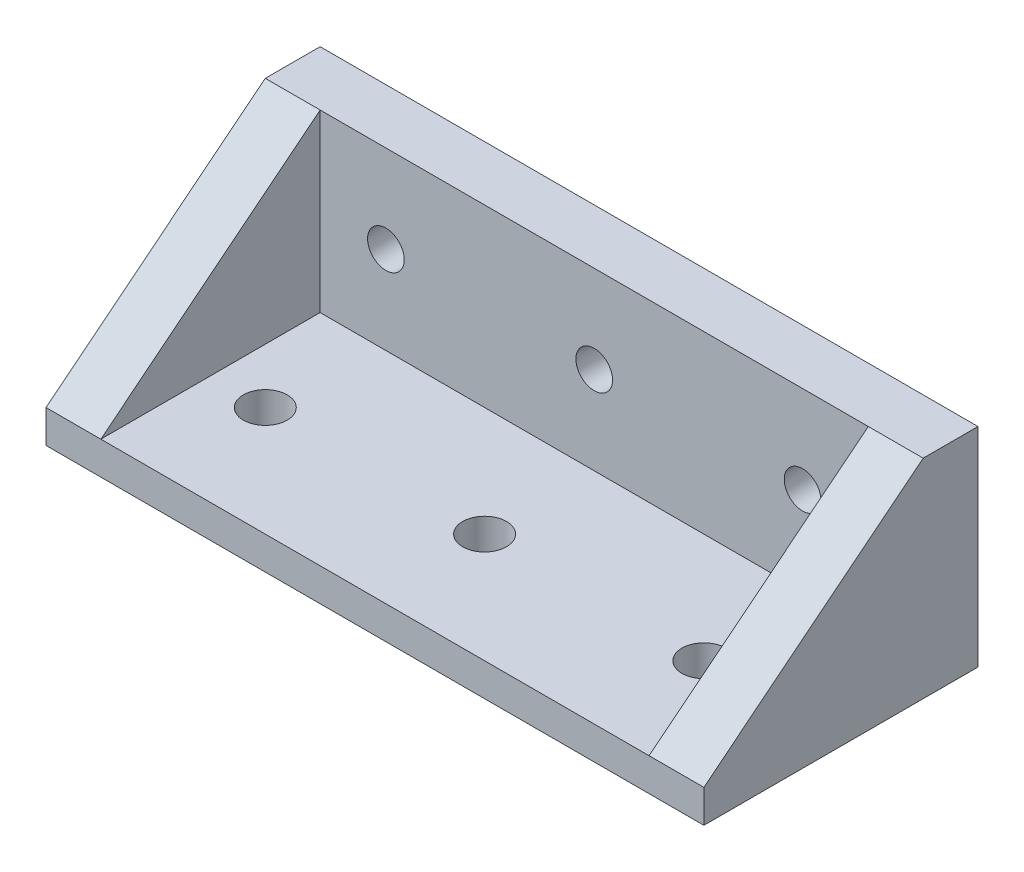
ISO-10303-21;
HEADER;
FILE_DESCRIPTION(('STEP AP214'),'2;1');
FILE_NAME('part.step','',(''),(''),'','','');
FILE_SCHEMA(('AUTOMOTIVE_DESIGN { 1 0 10303 214 1 1 1 1 }'));
ENDSEC;
DATA;
#1=APPLICATION_CONTEXT('core data for automotive mechanical design processes');
#2=APPLICATION_PROTOCOL_DEFINITION('international standard','automotive_design',2000,#1);
#3=PRODUCT_CONTEXT('',#1,'mechanical');
#4=PRODUCT('Part','Part','',(#3));
#5=PRODUCT_RELATED_PRODUCT_CATEGORY('part','',(#4));
#6=PRODUCT_DEFINITION_FORMATION('','',#4);
#7=PRODUCT_DEFINITION_CONTEXT('part definition',#1,'design');
#8=PRODUCT_DEFINITION('design','',#6,#7);
#9=PRODUCT_DEFINITION_SHAPE('','',#8);
#10=(LENGTH_UNIT() NAMED_UNIT(*) SI_UNIT(.MILLI.,.METRE.));
#11=(NAMED_UNIT(*) PLANE_ANGLE_UNIT() SI_UNIT($,.RADIAN.));
#12=(NAMED_UNIT(*) SI_UNIT($,.STERADIAN.) SOLID_ANGLE_UNIT());
#13=UNCERTAINTY_MEASURE_WITH_UNIT(LENGTH_MEASURE(1.E-05),#10,'distance_accuracy_value','');
#14=(GEOMETRIC_REPRESENTATION_CONTEXT(3) GLOBAL_UNCERTAINTY_ASSIGNED_CONTEXT((#13)) GLOBAL_UNIT_ASSIGNED_CONTEXT((#10,
#11,#12)) REPRESENTATION_CONTEXT('',''));
#15=CARTESIAN_POINT('',(0.,0.,0.));
#16=DIRECTION('',(0.,0.,1.));
#17=DIRECTION('',(1.,0.,0.));
#18=AXIS2_PLACEMENT_3D('',#15,#16,#17);
#19=CARTESIAN_POINT('',(0.,0.,5.));
#20=DIRECTION('',(1.,0.,0.));
#21=DIRECTION('',(0.,1.,0.));
#22=AXIS2_PLACEMENT_3D('',#19,#20,#21);
#23=PLANE('',#22);
#24=DIRECTION('',(0.,-1.,0.));
#25=VECTOR('',#24,1.);
#26=CARTESIAN_POINT('',(0.,0.,0.));
#27=LINE('',#26,#25);
#28=CARTESIAN_POINT('',(0.,0.,0.));
#29=VERTEX_POINT('',#28);
#30=CARTESIAN_POINT('',(0.,-19.,0.));
#31=VERTEX_POINT('',#30);
#32=EDGE_CURVE('E140',#29,#31,#27,.T.);
#33=ORIENTED_EDGE('',*,*,#32,.T.);
#34=DIRECTION('',(0.,0.,-1.));
#35=VECTOR('',#34,1.);
#36=CARTESIAN_POINT('',(0.,-19.,5.));
#37=LINE('',#36,#35);
#38=CARTESIAN_POINT('',(0.,-19.,25.));
#39=VERTEX_POINT('',#38);
#40=EDGE_CURVE('E11',#39,#31,#37,.T.);
#41=ORIENTED_EDGE('',*,*,#40,.F.);
#42=DIRECTION('',(0.,-1.,0.));
#43=VECTOR('',#42,1.);
#44=CARTESIAN_POINT('',(0.,-19.,25.));
#45=LINE('',#44,#43);
#46=CARTESIAN_POINT('',(0.,-16.,25.));
#47=VERTEX_POINT('',#46);
#48=EDGE_CURVE('E126',#47,#39,#45,.T.);
#49=ORIENTED_EDGE('',*,*,#48,.F.);
#50=DIRECTION('',(0.,-0.624695047554424,0.78086880944303));
#51=VECTOR('',#50,1.);
#52=CARTESIAN_POINT('',(0.,0.,5.));
#53=LINE('',#52,#51);
#54=CARTESIAN_POINT('',(0.,0.,5.));
#55=VERTEX_POINT('',#54);
#56=EDGE_CURVE('E123',#55,#47,#53,.T.);
#57=ORIENTED_EDGE('',*,*,#56,.F.);
#58=DIRECTION('',(0.,0.,-1.));
#59=VECTOR('',#58,1.);
#60=CARTESIAN_POINT('',(0.,0.,5.));
#61=LINE('',#60,#59);
#62=EDGE_CURVE('E139',#55,#29,#61,.T.);
#63=ORIENTED_EDGE('',*,*,#62,.T.);
#64=EDGE_LOOP('',(#33,#41,#49,#57,#63));
#65=FACE_BOUND('',#64,.T.);
#66=ADVANCED_FACE('F36',(#65),#23,.F.);
#67=CARTESIAN_POINT('',(0.,-19.,5.));
#68=DIRECTION('',(0.,1.,0.));
#69=DIRECTION('',(0.,0.,1.));
#70=AXIS2_PLACEMENT_3D('',#67,#68,#69);
#71=PLANE('',#70);
#72=CARTESIAN_POINT('',(10.,-19.,15.));
#73=DIRECTION('',(0.,1.,0.));
#74=DIRECTION('',(0.,0.,1.));
#75=AXIS2_PLACEMENT_3D('',#72,#73,#74);
#76=CIRCLE('',#75,2.);
#77=CARTESIAN_POINT('',(10.,-19.,17.));
#78=VERTEX_POINT('',#77);
#79=EDGE_CURVE('E356',#78,#78,#76,.T.);
#80=ORIENTED_EDGE('',*,*,#79,.T.);
#81=EDGE_LOOP('',(#80));
#82=FACE_BOUND('',#81,.T.);
#83=CARTESIAN_POINT('',(30.,-19.,15.));
#84=DIRECTION('',(0.,1.,0.));
#85=DIRECTION('',(0.,0.,1.));
#86=AXIS2_PLACEMENT_3D('',#83,#84,#85);
#87=CIRCLE('',#86,2.);
#88=CARTESIAN_POINT('',(30.,-19.,17.));
#89=VERTEX_POINT('',#88);
#90=EDGE_CURVE('E358',#89,#89,#87,.T.);
#91=ORIENTED_EDGE('',*,*,#90,.T.);
#92=EDGE_LOOP('',(#91));
#93=FACE_BOUND('',#92,.T.);
#94=CARTESIAN_POINT('',(50.,-19.,15.));
#95=DIRECTION('',(0.,1.,0.));
#96=DIRECTION('',(0.,0.,1.));
#97=AXIS2_PLACEMENT_3D('',#94,#95,#96);
#98=CIRCLE('',#97,2.);
#99=CARTESIAN_POINT('',(50.,-19.,17.));
#100=VERTEX_POINT('',#99);
#101=EDGE_CURVE('E364',#100,#100,#98,.T.);
#102=ORIENTED_EDGE('',*,*,#101,.T.);
#103=EDGE_LOOP('',(#102));
#104=FACE_BOUND('',#103,.T.);
#105=DIRECTION('',(1.,0.,0.));
#106=VECTOR('',#105,1.);
#107=CARTESIAN_POINT('',(0.,-19.,0.));
#108=LINE('',#107,#106);
#109=CARTESIAN_POINT('',(60.,-19.,0.));
#110=VERTEX_POINT('',#109);
#111=EDGE_CURVE('E143',#31,#110,#108,.T.);
#112=ORIENTED_EDGE('',*,*,#111,.T.);
#113=DIRECTION('',(0.,0.,-1.));
#114=VECTOR('',#113,1.);
#115=CARTESIAN_POINT('',(60.,-19.,5.));
#116=LINE('',#115,#114);
#117=CARTESIAN_POINT('',(60.,-19.,25.));
#118=VERTEX_POINT('',#117);
#119=EDGE_CURVE('E43',#118,#110,#116,.T.);
#120=ORIENTED_EDGE('',*,*,#119,.F.);
#121=DIRECTION('',(1.,0.,0.));
#122=VECTOR('',#121,1.);
#123=CARTESIAN_POINT('',(0.,-19.,25.));
#124=LINE('',#123,#122);
#125=EDGE_CURVE('E129',#39,#118,#124,.T.);
#126=ORIENTED_EDGE('',*,*,#125,.F.);
#127=ORIENTED_EDGE('',*,*,#40,.T.);
#128=EDGE_LOOP('',(#112,#120,#126,#127));
#129=FACE_BOUND('',#128,.T.);
#130=ADVANCED_FACE('F201',(#82,#93,#104,#129),#71,.F.);
#131=CARTESIAN_POINT('',(60.,0.,5.));
#132=DIRECTION('',(-1.,0.,0.));
#133=DIRECTION('',(0.,-1.,0.));
#134=AXIS2_PLACEMENT_3D('',#131,#132,#133);
#135=PLANE('',#134);
#136=DIRECTION('',(0.,0.,-1.));
#137=VECTOR('',#136,1.);
#138=CARTESIAN_POINT('',(60.,0.,5.));
#139=LINE('',#138,#137);
#140=CARTESIAN_POINT('',(60.,0.,5.));
#141=VERTEX_POINT('',#140);
#142=CARTESIAN_POINT('',(60.,0.,0.));
#143=VERTEX_POINT('',#142);
#144=EDGE_CURVE('E149',#141,#143,#139,.T.);
#145=ORIENTED_EDGE('',*,*,#144,.F.);
#146=DIRECTION('',(0.,-0.624695047554424,0.78086880944303));
#147=VECTOR('',#146,1.);
#148=CARTESIAN_POINT('',(60.,0.,5.));
#149=LINE('',#148,#147);
#150=CARTESIAN_POINT('',(60.,-16.,25.));
#151=VERTEX_POINT('',#150);
#152=EDGE_CURVE('E172',#141,#151,#149,.T.);
#153=ORIENTED_EDGE('',*,*,#152,.T.);
#154=DIRECTION('',(0.,1.,0.));
#155=VECTOR('',#154,1.);
#156=CARTESIAN_POINT('',(60.,-19.,25.));
#157=LINE('',#156,#155);
#158=EDGE_CURVE('E158',#118,#151,#157,.T.);
#159=ORIENTED_EDGE('',*,*,#158,.F.);
#160=ORIENTED_EDGE('',*,*,#119,.T.);
#161=DIRECTION('',(0.,1.,0.));
#162=VECTOR('',#161,1.);
#163=CARTESIAN_POINT('',(60.,0.,0.));
#164=LINE('',#163,#162);
#165=EDGE_CURVE('E145',#110,#143,#164,.T.);
#166=ORIENTED_EDGE('',*,*,#165,.T.);
#167=EDGE_LOOP('',(#145,#153,#159,#160,#166));
#168=FACE_BOUND('',#167,.T.);
#169=ADVANCED_FACE('F155',(#168),#135,.F.);
#170=CARTESIAN_POINT('',(0.,0.,5.));
#171=DIRECTION('',(0.,-1.,0.));
#172=DIRECTION('',(0.,0.,-1.));
#173=AXIS2_PLACEMENT_3D('',#170,#171,#172);
#174=PLANE('',#173);
#175=DIRECTION('',(-1.,0.,0.));
#176=VECTOR('',#175,1.);
#177=CARTESIAN_POINT('',(0.,0.,0.));
#178=LINE('',#177,#176);
#179=EDGE_CURVE('E58',#143,#29,#178,.T.);
#180=ORIENTED_EDGE('',*,*,#179,.T.);
#181=ORIENTED_EDGE('',*,*,#62,.F.);
#182=DIRECTION('',(-1.,0.,0.));
#183=VECTOR('',#182,1.);
#184=CARTESIAN_POINT('',(5.,0.,5.));
#185=LINE('',#184,#183);
#186=CARTESIAN_POINT('',(5.,0.,5.));
#187=VERTEX_POINT('',#186);
#188=EDGE_CURVE('E169',#187,#55,#185,.T.);
#189=ORIENTED_EDGE('',*,*,#188,.F.);
#190=DIRECTION('',(-1.,0.,0.));
#191=VECTOR('',#190,1.);
#192=CARTESIAN_POINT('',(0.,0.,5.));
#193=LINE('',#192,#191);
#194=CARTESIAN_POINT('',(55.,0.,5.));
#195=VERTEX_POINT('',#194);
#196=EDGE_CURVE('E122',#195,#187,#193,.T.);
#197=ORIENTED_EDGE('',*,*,#196,.F.);
#198=EDGE_CURVE('E137',#141,#195,#193,.T.);
#199=ORIENTED_EDGE('',*,*,#198,.F.);
#200=ORIENTED_EDGE('',*,*,#144,.T.);
#201=EDGE_LOOP('',(#180,#181,#189,#197,#199,#200));
#202=FACE_BOUND('',#201,.T.);
#203=ADVANCED_FACE('F168',(#202),#174,.F.);
#204=CARTESIAN_POINT('',(0.,0.,5.));
#205=DIRECTION('',(0.,0.,1.));
#206=DIRECTION('',(1.,0.,0.));
#207=AXIS2_PLACEMENT_3D('',#204,#205,#206);
#208=PLANE('',#207);
#209=CARTESIAN_POINT('',(11.,-8.,5.));
#210=DIRECTION('',(0.,0.,1.));
#211=DIRECTION('',(1.,0.,0.));
#212=AXIS2_PLACEMENT_3D('',#209,#210,#211);
#213=CIRCLE('',#212,1.67292172028109);
#214=CARTESIAN_POINT('',(12.6729217202811,-8.,5.));
#215=VERTEX_POINT('',#214);
#216=EDGE_CURVE('E371',#215,#215,#213,.T.);
#217=ORIENTED_EDGE('',*,*,#216,.F.);
#218=EDGE_LOOP('',(#217));
#219=FACE_BOUND('',#218,.T.);
#220=CARTESIAN_POINT('',(30.,-8.,5.));
#221=DIRECTION('',(0.,0.,1.));
#222=DIRECTION('',(1.,0.,0.));
#223=AXIS2_PLACEMENT_3D('',#220,#221,#222);
#224=CIRCLE('',#223,1.6729217202811);
#225=CARTESIAN_POINT('',(31.6729217202811,-8.,5.));
#226=VERTEX_POINT('',#225);
#227=EDGE_CURVE('E377',#226,#226,#224,.T.);
#228=ORIENTED_EDGE('',*,*,#227,.F.);
#229=EDGE_LOOP('',(#228));
#230=FACE_BOUND('',#229,.T.);
#231=CARTESIAN_POINT('',(49.,-8.,5.));
#232=DIRECTION('',(0.,0.,1.));
#233=DIRECTION('',(1.,0.,0.));
#234=AXIS2_PLACEMENT_3D('',#231,#232,#233);
#235=CIRCLE('',#234,1.67292172028109);
#236=CARTESIAN_POINT('',(50.6729217202811,-8.,5.));
#237=VERTEX_POINT('',#236);
#238=EDGE_CURVE('E357',#237,#237,#235,.T.);
#239=ORIENTED_EDGE('',*,*,#238,.F.);
#240=EDGE_LOOP('',(#239));
#241=FACE_BOUND('',#240,.T.);
#242=DIRECTION('',(0.,1.,0.));
#243=VECTOR('',#242,1.);
#244=CARTESIAN_POINT('',(5.,-16.,5.));
#245=LINE('',#244,#243);
#246=CARTESIAN_POINT('',(5.,-16.,5.));
#247=VERTEX_POINT('',#246);
#248=EDGE_CURVE('E106',#247,#187,#245,.T.);
#249=ORIENTED_EDGE('',*,*,#248,.F.);
#250=DIRECTION('',(-1.,0.,0.));
#251=VECTOR('',#250,1.);
#252=CARTESIAN_POINT('',(0.,-16.,5.));
#253=LINE('',#252,#251);
#254=CARTESIAN_POINT('',(55.,-16.,5.));
#255=VERTEX_POINT('',#254);
#256=EDGE_CURVE('E120',#255,#247,#253,.T.);
#257=ORIENTED_EDGE('',*,*,#256,.F.);
#258=DIRECTION('',(0.,1.,0.));
#259=VECTOR('',#258,1.);
#260=CARTESIAN_POINT('',(55.,-16.,5.));
#261=LINE('',#260,#259);
#262=EDGE_CURVE('E175',#255,#195,#261,.T.);
#263=ORIENTED_EDGE('',*,*,#262,.T.);
#264=ORIENTED_EDGE('',*,*,#196,.T.);
#265=EDGE_LOOP('',(#249,#257,#263,#264));
#266=FACE_BOUND('',#265,.T.);
#267=ADVANCED_FACE('F118',(#219,#230,#241,#266),#208,.T.);
#268=CARTESIAN_POINT('',(0.,0.,0.));
#269=DIRECTION('',(0.,0.,1.));
#270=DIRECTION('',(1.,0.,0.));
#271=AXIS2_PLACEMENT_3D('',#268,#269,#270);
#272=PLANE('',#271);
#273=CARTESIAN_POINT('',(11.,-8.,0.));
#274=DIRECTION('',(0.,0.,1.));
#275=DIRECTION('',(1.,0.,0.));
#276=AXIS2_PLACEMENT_3D('',#273,#274,#275);
#277=CIRCLE('',#276,1.67292172028109);
#278=CARTESIAN_POINT('',(12.6729217202811,-8.,0.));
#279=VERTEX_POINT('',#278);
#280=EDGE_CURVE('E368',#279,#279,#277,.T.);
#281=ORIENTED_EDGE('',*,*,#280,.T.);
#282=EDGE_LOOP('',(#281));
#283=FACE_BOUND('',#282,.T.);
#284=CARTESIAN_POINT('',(30.,-8.,0.));
#285=DIRECTION('',(0.,0.,1.));
#286=DIRECTION('',(1.,0.,0.));
#287=AXIS2_PLACEMENT_3D('',#284,#285,#286);
#288=CIRCLE('',#287,1.6729217202811);
#289=CARTESIAN_POINT('',(31.6729217202811,-8.,0.));
#290=VERTEX_POINT('',#289);
#291=EDGE_CURVE('E374',#290,#290,#288,.T.);
#292=ORIENTED_EDGE('',*,*,#291,.T.);
#293=EDGE_LOOP('',(#292));
#294=FACE_BOUND('',#293,.T.);
#295=CARTESIAN_POINT('',(49.,-8.,0.));
#296=DIRECTION('',(0.,0.,1.));
#297=DIRECTION('',(1.,0.,0.));
#298=AXIS2_PLACEMENT_3D('',#295,#296,#297);
#299=CIRCLE('',#298,1.67292172028109);
#300=CARTESIAN_POINT('',(50.6729217202811,-8.,0.));
#301=VERTEX_POINT('',#300);
#302=EDGE_CURVE('E361',#301,#301,#299,.T.);
#303=ORIENTED_EDGE('',*,*,#302,.T.);
#304=EDGE_LOOP('',(#303));
#305=FACE_BOUND('',#304,.T.);
#306=ORIENTED_EDGE('',*,*,#32,.F.);
#307=ORIENTED_EDGE('',*,*,#179,.F.);
#308=ORIENTED_EDGE('',*,*,#165,.F.);
#309=ORIENTED_EDGE('',*,*,#111,.F.);
#310=EDGE_LOOP('',(#306,#307,#308,#309));
#311=FACE_BOUND('',#310,.T.);
#312=ADVANCED_FACE('F164',(#283,#294,#305,#311),#272,.F.);
#313=CARTESIAN_POINT('',(0.,-16.,25.));
#314=DIRECTION('',(0.,-1.,0.));
#315=DIRECTION('',(0.,0.,-1.));
#316=AXIS2_PLACEMENT_3D('',#313,#314,#315);
#317=PLANE('',#316);
#318=CARTESIAN_POINT('',(10.,-16.,15.));
#319=DIRECTION('',(0.,1.,0.));
#320=DIRECTION('',(0.,0.,1.));
#321=AXIS2_PLACEMENT_3D('',#318,#319,#320);
#322=CIRCLE('',#321,2.);
#323=CARTESIAN_POINT('',(10.,-16.,17.));
#324=VERTEX_POINT('',#323);
#325=EDGE_CURVE('E354',#324,#324,#322,.T.);
#326=ORIENTED_EDGE('',*,*,#325,.F.);
#327=EDGE_LOOP('',(#326));
#328=FACE_BOUND('',#327,.T.);
#329=CARTESIAN_POINT('',(30.,-16.,15.));
#330=DIRECTION('',(0.,1.,0.));
#331=DIRECTION('',(0.,0.,1.));
#332=AXIS2_PLACEMENT_3D('',#329,#330,#331);
#333=CIRCLE('',#332,2.);
#334=CARTESIAN_POINT('',(30.,-16.,17.));
#335=VERTEX_POINT('',#334);
#336=EDGE_CURVE('E399',#335,#335,#333,.T.);
#337=ORIENTED_EDGE('',*,*,#336,.F.);
#338=EDGE_LOOP('',(#337));
#339=FACE_BOUND('',#338,.T.);
#340=CARTESIAN_POINT('',(50.,-16.,15.));
#341=DIRECTION('',(0.,1.,0.));
#342=DIRECTION('',(0.,0.,1.));
#343=AXIS2_PLACEMENT_3D('',#340,#341,#342);
#344=CIRCLE('',#343,2.);
#345=CARTESIAN_POINT('',(50.,-16.,17.));
#346=VERTEX_POINT('',#345);
#347=EDGE_CURVE('E396',#346,#346,#344,.T.);
#348=ORIENTED_EDGE('',*,*,#347,.F.);
#349=EDGE_LOOP('',(#348));
#350=FACE_BOUND('',#349,.T.);
#351=ORIENTED_EDGE('',*,*,#256,.T.);
#352=DIRECTION('',(0.,0.,-1.));
#353=VECTOR('',#352,1.);
#354=CARTESIAN_POINT('',(5.,-16.,25.));
#355=LINE('',#354,#353);
#356=CARTESIAN_POINT('',(5.,-16.,25.));
#357=VERTEX_POINT('',#356);
#358=EDGE_CURVE('E103',#357,#247,#355,.T.);
#359=ORIENTED_EDGE('',*,*,#358,.F.);
#360=DIRECTION('',(-1.,0.,0.));
#361=VECTOR('',#360,1.);
#362=CARTESIAN_POINT('',(0.,-16.,25.));
#363=LINE('',#362,#361);
#364=CARTESIAN_POINT('',(55.,-16.,25.));
#365=VERTEX_POINT('',#364);
#366=EDGE_CURVE('E184',#365,#357,#363,.T.);
#367=ORIENTED_EDGE('',*,*,#366,.F.);
#368=DIRECTION('',(0.,0.,-1.));
#369=VECTOR('',#368,1.);
#370=CARTESIAN_POINT('',(55.,-16.,25.));
#371=LINE('',#370,#369);
#372=EDGE_CURVE('E50',#365,#255,#371,.T.);
#373=ORIENTED_EDGE('',*,*,#372,.T.);
#374=EDGE_LOOP('',(#351,#359,#367,#373));
#375=FACE_BOUND('',#374,.T.);
#376=ADVANCED_FACE('F125',(#328,#339,#350,#375),#317,.F.);
#377=CARTESIAN_POINT('',(0.,0.,25.));
#378=DIRECTION('',(0.,0.,-1.));
#379=DIRECTION('',(-1.,0.,0.));
#380=AXIS2_PLACEMENT_3D('',#377,#378,#379);
#381=PLANE('',#380);
#382=ORIENTED_EDGE('',*,*,#48,.T.);
#383=ORIENTED_EDGE('',*,*,#125,.T.);
#384=ORIENTED_EDGE('',*,*,#158,.T.);
#385=EDGE_CURVE('E135',#151,#365,#363,.T.);
#386=ORIENTED_EDGE('',*,*,#385,.T.);
#387=ORIENTED_EDGE('',*,*,#366,.T.);
#388=DIRECTION('',(-1.,0.,0.));
#389=VECTOR('',#388,1.);
#390=CARTESIAN_POINT('',(5.,-16.,25.));
#391=LINE('',#390,#389);
#392=EDGE_CURVE('E173',#357,#47,#391,.T.);
#393=ORIENTED_EDGE('',*,*,#392,.T.);
#394=EDGE_LOOP('',(#382,#383,#384,#386,#387,#393));
#395=FACE_BOUND('',#394,.T.);
#396=ADVANCED_FACE('F187',(#395),#381,.F.);
#397=CARTESIAN_POINT('',(55.,0.,5.));
#398=DIRECTION('',(0.,0.78086880944303,0.624695047554424));
#399=DIRECTION('',(0.,-0.624695047554424,0.78086880944303));
#400=AXIS2_PLACEMENT_3D('',#397,#398,#399);
#401=PLANE('',#400);
#402=ORIENTED_EDGE('',*,*,#152,.F.);
#403=ORIENTED_EDGE('',*,*,#198,.T.);
#404=DIRECTION('',(0.,-0.624695047554424,0.78086880944303));
#405=VECTOR('',#404,1.);
#406=CARTESIAN_POINT('',(55.,0.,5.));
#407=LINE('',#406,#405);
#408=EDGE_CURVE('E131',#195,#365,#407,.T.);
#409=ORIENTED_EDGE('',*,*,#408,.T.);
#410=ORIENTED_EDGE('',*,*,#385,.F.);
#411=EDGE_LOOP('',(#402,#403,#409,#410));
#412=FACE_BOUND('',#411,.T.);
#413=ADVANCED_FACE('F189',(#412),#401,.T.);
#414=CARTESIAN_POINT('',(55.,0.,0.));
#415=DIRECTION('',(-1.,0.,0.));
#416=DIRECTION('',(0.,-1.,0.));
#417=AXIS2_PLACEMENT_3D('',#414,#415,#416);
#418=PLANE('',#417);
#419=ORIENTED_EDGE('',*,*,#262,.F.);
#420=ORIENTED_EDGE('',*,*,#372,.F.);
#421=ORIENTED_EDGE('',*,*,#408,.F.);
#422=EDGE_LOOP('',(#419,#420,#421));
#423=FACE_BOUND('',#422,.T.);
#424=ADVANCED_FACE('F190',(#423),#418,.T.);
#425=CARTESIAN_POINT('',(5.,0.,5.));
#426=DIRECTION('',(0.,-0.78086880944303,-0.624695047554424));
#427=DIRECTION('',(0.,0.624695047554424,-0.78086880944303));
#428=AXIS2_PLACEMENT_3D('',#425,#426,#427);
#429=PLANE('',#428);
#430=ORIENTED_EDGE('',*,*,#56,.T.);
#431=ORIENTED_EDGE('',*,*,#392,.F.);
#432=DIRECTION('',(0.,-0.624695047554424,0.78086880944303));
#433=VECTOR('',#432,1.);
#434=CARTESIAN_POINT('',(5.,0.,5.));
#435=LINE('',#434,#433);
#436=EDGE_CURVE('E108',#187,#357,#435,.T.);
#437=ORIENTED_EDGE('',*,*,#436,.F.);
#438=ORIENTED_EDGE('',*,*,#188,.T.);
#439=EDGE_LOOP('',(#430,#431,#437,#438));
#440=FACE_BOUND('',#439,.T.);
#441=ADVANCED_FACE('F192',(#440),#429,.F.);
#442=CARTESIAN_POINT('',(5.,0.,0.));
#443=DIRECTION('',(1.,0.,0.));
#444=DIRECTION('',(0.,-1.,0.));
#445=AXIS2_PLACEMENT_3D('',#442,#443,#444);
#446=PLANE('',#445);
#447=ORIENTED_EDGE('',*,*,#248,.T.);
#448=ORIENTED_EDGE('',*,*,#436,.T.);
#449=ORIENTED_EDGE('',*,*,#358,.T.);
#450=EDGE_LOOP('',(#447,#448,#449));
#451=FACE_BOUND('',#450,.T.);
#452=ADVANCED_FACE('F105',(#451),#446,.T.);
#453=CARTESIAN_POINT('',(49.,-8.,0.));
#454=DIRECTION('',(0.,0.,1.));
#455=DIRECTION('',(1.,0.,0.));
#456=AXIS2_PLACEMENT_3D('',#453,#454,#455);
#457=CYLINDRICAL_SURFACE('',#456,1.67292172028109);
#458=ORIENTED_EDGE('',*,*,#302,.F.);
#459=EDGE_LOOP('',(#458));
#460=FACE_BOUND('',#459,.T.);
#461=ORIENTED_EDGE('',*,*,#238,.T.);
#462=EDGE_LOOP('',(#461));
#463=FACE_BOUND('',#462,.T.);
#464=ADVANCED_FACE('F271',(#460,#463),#457,.F.);
#465=CARTESIAN_POINT('',(30.,-8.,0.));
#466=DIRECTION('',(0.,0.,1.));
#467=DIRECTION('',(1.,0.,0.));
#468=AXIS2_PLACEMENT_3D('',#465,#466,#467);
#469=CYLINDRICAL_SURFACE('',#468,1.6729217202811);
#470=ORIENTED_EDGE('',*,*,#291,.F.);
#471=EDGE_LOOP('',(#470));
#472=FACE_BOUND('',#471,.T.);
#473=ORIENTED_EDGE('',*,*,#227,.T.);
#474=EDGE_LOOP('',(#473));
#475=FACE_BOUND('',#474,.T.);
#476=ADVANCED_FACE('F276',(#472,#475),#469,.F.);
#477=CARTESIAN_POINT('',(11.,-8.,0.));
#478=DIRECTION('',(0.,0.,1.));
#479=DIRECTION('',(1.,0.,0.));
#480=AXIS2_PLACEMENT_3D('',#477,#478,#479);
#481=CYLINDRICAL_SURFACE('',#480,1.67292172028109);
#482=ORIENTED_EDGE('',*,*,#280,.F.);
#483=EDGE_LOOP('',(#482));
#484=FACE_BOUND('',#483,.T.);
#485=ORIENTED_EDGE('',*,*,#216,.T.);
#486=EDGE_LOOP('',(#485));
#487=FACE_BOUND('',#486,.T.);
#488=ADVANCED_FACE('F288',(#484,#487),#481,.F.);
#489=CARTESIAN_POINT('',(50.,-21.,15.));
#490=DIRECTION('',(0.,1.,0.));
#491=DIRECTION('',(0.,0.,1.));
#492=AXIS2_PLACEMENT_3D('',#489,#490,#491);
#493=CYLINDRICAL_SURFACE('',#492,2.);
#494=ORIENTED_EDGE('',*,*,#347,.T.);
#495=EDGE_LOOP('',(#494));
#496=FACE_BOUND('',#495,.T.);
#497=ORIENTED_EDGE('',*,*,#101,.F.);
#498=EDGE_LOOP('',(#497));
#499=FACE_BOUND('',#498,.T.);
#500=ADVANCED_FACE('F297',(#496,#499),#493,.F.);
#501=CARTESIAN_POINT('',(30.,-21.,15.));
#502=DIRECTION('',(0.,1.,0.));
#503=DIRECTION('',(0.,0.,1.));
#504=AXIS2_PLACEMENT_3D('',#501,#502,#503);
#505=CYLINDRICAL_SURFACE('',#504,2.);
#506=ORIENTED_EDGE('',*,*,#336,.T.);
#507=EDGE_LOOP('',(#506));
#508=FACE_BOUND('',#507,.T.);
#509=ORIENTED_EDGE('',*,*,#90,.F.);
#510=EDGE_LOOP('',(#509));
#511=FACE_BOUND('',#510,.T.);
#512=ADVANCED_FACE('F318',(#508,#511),#505,.F.);
#513=CARTESIAN_POINT('',(10.,-21.,15.));
#514=DIRECTION('',(0.,1.,0.));
#515=DIRECTION('',(0.,0.,1.));
#516=AXIS2_PLACEMENT_3D('',#513,#514,#515);
#517=CYLINDRICAL_SURFACE('',#516,2.);
#518=ORIENTED_EDGE('',*,*,#325,.T.);
#519=EDGE_LOOP('',(#518));
#520=FACE_BOUND('',#519,.T.);
#521=ORIENTED_EDGE('',*,*,#79,.F.);
#522=EDGE_LOOP('',(#521));
#523=FACE_BOUND('',#522,.T.);
#524=ADVANCED_FACE('F328',(#520,#523),#517,.F.);
#525=CLOSED_SHELL('',(#66,#130,#169,#203,#267,#312,#376,#396,#413,#424,#441,#452,#464,#476,#488,
#500,#512,#524));
#526=MANIFOLD_SOLID_BREP('B2',#525);
#527=ADVANCED_BREP_SHAPE_REPRESENTATION('',(#18,#526),#14);
#528=SHAPE_DEFINITION_REPRESENTATION(#9,#527);
ENDSEC;
END-ISO-10303-21;
